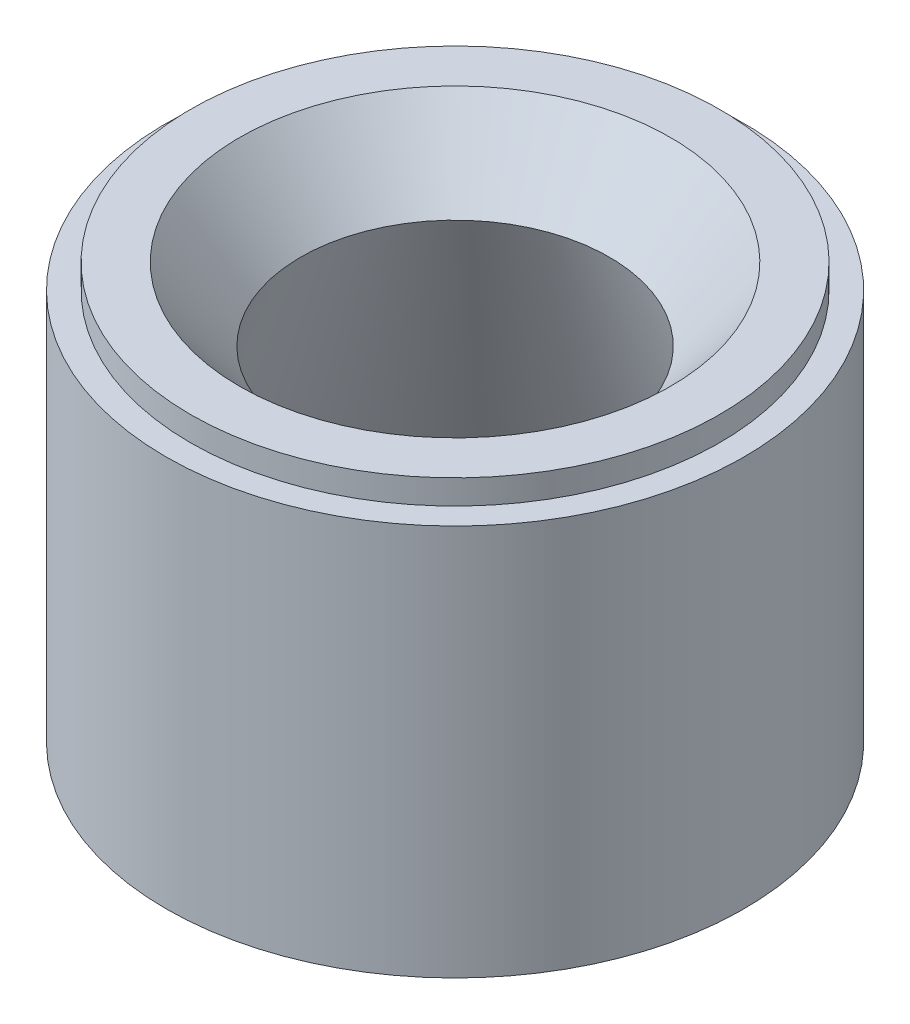
ISO-10303-21;
HEADER;
FILE_DESCRIPTION(('STEP AP214'),'2;1');
FILE_NAME('part.step','',(''),(''),'','','');
FILE_SCHEMA(('AUTOMOTIVE_DESIGN { 1 0 10303 214 1 1 1 1 }'));
ENDSEC;
DATA;
#1=APPLICATION_CONTEXT('core data for automotive mechanical design processes');
#2=APPLICATION_PROTOCOL_DEFINITION('international standard','automotive_design',2000,#1);
#3=PRODUCT_CONTEXT('',#1,'mechanical');
#4=PRODUCT('Part','Part','',(#3));
#5=PRODUCT_RELATED_PRODUCT_CATEGORY('part','',(#4));
#6=PRODUCT_DEFINITION_FORMATION('','',#4);
#7=PRODUCT_DEFINITION_CONTEXT('part definition',#1,'design');
#8=PRODUCT_DEFINITION('design','',#6,#7);
#9=PRODUCT_DEFINITION_SHAPE('','',#8);
#10=(LENGTH_UNIT() NAMED_UNIT(*) SI_UNIT(.MILLI.,.METRE.));
#11=(NAMED_UNIT(*) PLANE_ANGLE_UNIT() SI_UNIT($,.RADIAN.));
#12=(NAMED_UNIT(*) SI_UNIT($,.STERADIAN.) SOLID_ANGLE_UNIT());
#13=UNCERTAINTY_MEASURE_WITH_UNIT(LENGTH_MEASURE(1.E-05),#10,'distance_accuracy_value','');
#14=(GEOMETRIC_REPRESENTATION_CONTEXT(3) GLOBAL_UNCERTAINTY_ASSIGNED_CONTEXT((#13)) GLOBAL_UNIT_ASSIGNED_CONTEXT((#10,
#11,#12)) REPRESENTATION_CONTEXT('',''));
#15=CARTESIAN_POINT('',(0.,0.,0.));
#16=DIRECTION('',(0.,0.,1.));
#17=DIRECTION('',(1.,0.,0.));
#18=AXIS2_PLACEMENT_3D('',#15,#16,#17);
#19=CARTESIAN_POINT('',(0.,-18.9353814299376,0.));
#20=DIRECTION('',(0.,1.,0.));
#21=DIRECTION('',(0.,0.,1.));
#22=AXIS2_PLACEMENT_3D('',#19,#20,#21);
#23=CONICAL_SURFACE('',#22,40.0613284259383,0.69813170079773);
#24=CARTESIAN_POINT('',(0.,0.,0.));
#25=DIRECTION('',(0.,1.,0.));
#26=DIRECTION('',(0.,0.,1.));
#27=AXIS2_PLACEMENT_3D('',#24,#25,#26);
#28=CIRCLE('',#27,55.95);
#29=CARTESIAN_POINT('',(0.,0.,55.95));
#30=VERTEX_POINT('',#29);
#31=EDGE_CURVE('E57',#30,#30,#28,.T.);
#32=ORIENTED_EDGE('',*,*,#31,.T.);
#33=EDGE_LOOP('',(#32));
#34=FACE_BOUND('',#33,.T.);
#35=CARTESIAN_POINT('',(0.,-18.9353814299376,0.));
#36=DIRECTION('',(0.,1.,0.));
#37=DIRECTION('',(0.,0.,1.));
#38=AXIS2_PLACEMENT_3D('',#35,#36,#37);
#39=CIRCLE('',#38,40.0613284259383);
#40=CARTESIAN_POINT('',(0.,-18.9353814299376,40.0613284259383));
#41=VERTEX_POINT('',#40);
#42=EDGE_CURVE('E10',#41,#41,#39,.T.);
#43=ORIENTED_EDGE('',*,*,#42,.F.);
#44=EDGE_LOOP('',(#43));
#45=FACE_BOUND('',#44,.T.);
#46=ADVANCED_FACE('F32',(#34,#45),#23,.F.);
#47=CARTESIAN_POINT('',(0.,-107.95,0.));
#48=DIRECTION('',(0.,-1.,0.));
#49=DIRECTION('',(0.,0.,-1.));
#50=AXIS2_PLACEMENT_3D('',#47,#48,#49);
#51=CONICAL_SURFACE('',#50,72.46,0.34906585039886);
#52=ORIENTED_EDGE('',*,*,#42,.T.);
#53=EDGE_LOOP('',(#52));
#54=FACE_BOUND('',#53,.T.);
#55=CARTESIAN_POINT('',(0.,-107.95,0.));
#56=DIRECTION('',(0.,1.,0.));
#57=DIRECTION('',(0.,0.,1.));
#58=AXIS2_PLACEMENT_3D('',#55,#56,#57);
#59=CIRCLE('',#58,72.46);
#60=CARTESIAN_POINT('',(0.,-107.95,72.46));
#61=VERTEX_POINT('',#60);
#62=EDGE_CURVE('E38',#61,#61,#59,.T.);
#63=ORIENTED_EDGE('',*,*,#62,.F.);
#64=EDGE_LOOP('',(#63));
#65=FACE_BOUND('',#64,.T.);
#66=ADVANCED_FACE('F75',(#54,#65),#51,.F.);
#67=CARTESIAN_POINT('',(-75.,-107.95,0.));
#68=DIRECTION('',(0.,-1.,0.));
#69=DIRECTION('',(0.,0.,-1.));
#70=AXIS2_PLACEMENT_3D('',#67,#68,#69);
#71=PLANE('',#70);
#72=ORIENTED_EDGE('',*,*,#62,.T.);
#73=EDGE_LOOP('',(#72));
#74=FACE_BOUND('',#73,.T.);
#75=CARTESIAN_POINT('',(0.,-107.95,0.));
#76=DIRECTION('',(0.,1.,0.));
#77=DIRECTION('',(0.,0.,1.));
#78=AXIS2_PLACEMENT_3D('',#75,#76,#77);
#79=CIRCLE('',#78,75.);
#80=CARTESIAN_POINT('',(0.,-107.95,75.));
#81=VERTEX_POINT('',#80);
#82=EDGE_CURVE('E42',#81,#81,#79,.T.);
#83=ORIENTED_EDGE('',*,*,#82,.F.);
#84=EDGE_LOOP('',(#83));
#85=FACE_BOUND('',#84,.T.);
#86=ADVANCED_FACE('F79',(#74,#85),#71,.T.);
#87=CARTESIAN_POINT('',(0.,0.,0.));
#88=DIRECTION('',(0.,1.,0.));
#89=DIRECTION('',(0.,0.,1.));
#90=AXIS2_PLACEMENT_3D('',#87,#88,#89);
#91=CYLINDRICAL_SURFACE('',#90,75.);
#92=ORIENTED_EDGE('',*,*,#82,.T.);
#93=EDGE_LOOP('',(#92));
#94=FACE_BOUND('',#93,.T.);
#95=CARTESIAN_POINT('',(0.,-6.35,0.));
#96=DIRECTION('',(0.,1.,0.));
#97=DIRECTION('',(0.,0.,1.));
#98=AXIS2_PLACEMENT_3D('',#95,#96,#97);
#99=CIRCLE('',#98,75.);
#100=CARTESIAN_POINT('',(0.,-6.35,75.));
#101=VERTEX_POINT('',#100);
#102=EDGE_CURVE('E46',#101,#101,#99,.T.);
#103=ORIENTED_EDGE('',*,*,#102,.F.);
#104=EDGE_LOOP('',(#103));
#105=FACE_BOUND('',#104,.T.);
#106=ADVANCED_FACE('F83',(#94,#105),#91,.T.);
#107=CARTESIAN_POINT('',(-68.65,-6.35,0.));
#108=DIRECTION('',(0.,1.,0.));
#109=DIRECTION('',(0.,0.,1.));
#110=AXIS2_PLACEMENT_3D('',#107,#108,#109);
#111=PLANE('',#110);
#112=ORIENTED_EDGE('',*,*,#102,.T.);
#113=EDGE_LOOP('',(#112));
#114=FACE_BOUND('',#113,.T.);
#115=CARTESIAN_POINT('',(0.,-6.35,0.));
#116=DIRECTION('',(0.,1.,0.));
#117=DIRECTION('',(0.,0.,1.));
#118=AXIS2_PLACEMENT_3D('',#115,#116,#117);
#119=CIRCLE('',#118,68.65);
#120=CARTESIAN_POINT('',(0.,-6.35,68.65));
#121=VERTEX_POINT('',#120);
#122=EDGE_CURVE('E51',#121,#121,#119,.T.);
#123=ORIENTED_EDGE('',*,*,#122,.F.);
#124=EDGE_LOOP('',(#123));
#125=FACE_BOUND('',#124,.T.);
#126=ADVANCED_FACE('F71',(#114,#125),#111,.T.);
#127=CARTESIAN_POINT('',(0.,0.,0.));
#128=DIRECTION('',(0.,1.,0.));
#129=DIRECTION('',(0.,0.,1.));
#130=AXIS2_PLACEMENT_3D('',#127,#128,#129);
#131=CYLINDRICAL_SURFACE('',#130,68.65);
#132=ORIENTED_EDGE('',*,*,#122,.T.);
#133=EDGE_LOOP('',(#132));
#134=FACE_BOUND('',#133,.T.);
#135=CARTESIAN_POINT('',(0.,0.,0.));
#136=DIRECTION('',(0.,1.,0.));
#137=DIRECTION('',(0.,0.,1.));
#138=AXIS2_PLACEMENT_3D('',#135,#136,#137);
#139=CIRCLE('',#138,68.65);
#140=CARTESIAN_POINT('',(0.,0.,68.65));
#141=VERTEX_POINT('',#140);
#142=EDGE_CURVE('E54',#141,#141,#139,.T.);
#143=ORIENTED_EDGE('',*,*,#142,.F.);
#144=EDGE_LOOP('',(#143));
#145=FACE_BOUND('',#144,.T.);
#146=ADVANCED_FACE('F65',(#134,#145),#131,.T.);
#147=CARTESIAN_POINT('',(-55.95,0.,0.));
#148=DIRECTION('',(0.,1.,0.));
#149=DIRECTION('',(0.,0.,1.));
#150=AXIS2_PLACEMENT_3D('',#147,#148,#149);
#151=PLANE('',#150);
#152=ORIENTED_EDGE('',*,*,#142,.T.);
#153=EDGE_LOOP('',(#152));
#154=FACE_BOUND('',#153,.T.);
#155=ORIENTED_EDGE('',*,*,#31,.F.);
#156=EDGE_LOOP('',(#155));
#157=FACE_BOUND('',#156,.T.);
#158=ADVANCED_FACE('F63',(#154,#157),#151,.T.);
#159=CLOSED_SHELL('',(#46,#66,#86,#106,#126,#146,#158));
#160=MANIFOLD_SOLID_BREP('B2',#159);
#161=ADVANCED_BREP_SHAPE_REPRESENTATION('',(#18,#160),#14);
#162=SHAPE_DEFINITION_REPRESENTATION(#9,#161);
ENDSEC;
END-ISO-10303-21;
